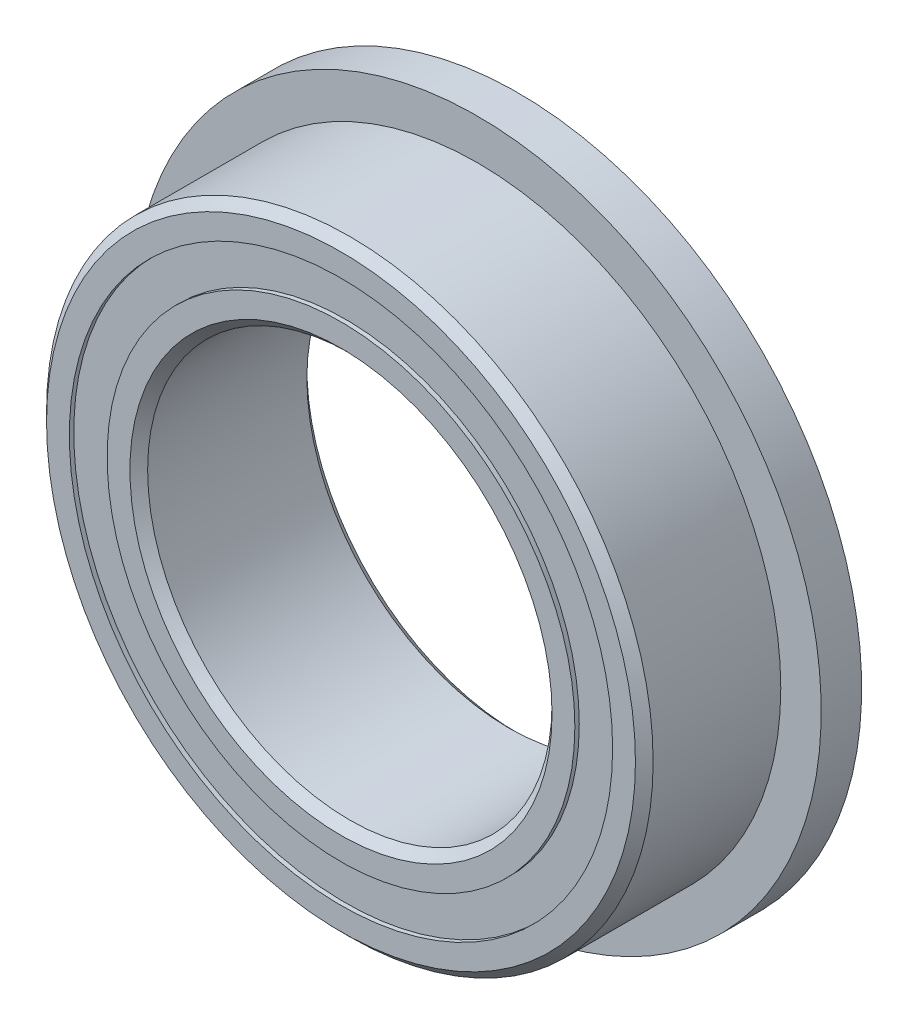
ISO-10303-21;
HEADER;
FILE_DESCRIPTION(('STEP AP214'),'2;1');
FILE_NAME('part.step','',(''),(''),'','','');
FILE_SCHEMA(('AUTOMOTIVE_DESIGN { 1 0 10303 214 1 1 1 1 }'));
ENDSEC;
DATA;
#1=APPLICATION_CONTEXT('core data for automotive mechanical design processes');
#2=APPLICATION_PROTOCOL_DEFINITION('international standard','automotive_design',2000,#1);
#3=PRODUCT_CONTEXT('',#1,'mechanical');
#4=PRODUCT('Part','Part','',(#3));
#5=PRODUCT_RELATED_PRODUCT_CATEGORY('part','',(#4));
#6=PRODUCT_DEFINITION_FORMATION('','',#4);
#7=PRODUCT_DEFINITION_CONTEXT('part definition',#1,'design');
#8=PRODUCT_DEFINITION('design','',#6,#7);
#9=PRODUCT_DEFINITION_SHAPE('','',#8);
#10=(LENGTH_UNIT() NAMED_UNIT(*) SI_UNIT(.MILLI.,.METRE.));
#11=(NAMED_UNIT(*) PLANE_ANGLE_UNIT() SI_UNIT($,.RADIAN.));
#12=(NAMED_UNIT(*) SI_UNIT($,.STERADIAN.) SOLID_ANGLE_UNIT());
#13=UNCERTAINTY_MEASURE_WITH_UNIT(LENGTH_MEASURE(1.E-05),#10,'distance_accuracy_value','');
#14=(GEOMETRIC_REPRESENTATION_CONTEXT(3) GLOBAL_UNCERTAINTY_ASSIGNED_CONTEXT((#13)) GLOBAL_UNIT_ASSIGNED_CONTEXT((#10,
#11,#12)) REPRESENTATION_CONTEXT('',''));
#15=CARTESIAN_POINT('',(0.,0.,0.));
#16=DIRECTION('',(0.,0.,1.));
#17=DIRECTION('',(1.,0.,0.));
#18=AXIS2_PLACEMENT_3D('',#15,#16,#17);
#19=CARTESIAN_POINT('',(0.,5.37362637362637,-1.6625));
#20=DIRECTION('',(0.,0.,1.));
#21=DIRECTION('',(1.,0.,0.));
#22=AXIS2_PLACEMENT_3D('',#19,#20,#21);
#23=PLANE('',#22);
#24=CARTESIAN_POINT('',(0.,0.,-1.6625));
#25=DIRECTION('',(0.,0.,1.));
#26=DIRECTION('',(1.,0.,0.));
#27=AXIS2_PLACEMENT_3D('',#24,#25,#26);
#28=CIRCLE('',#27,5.37362637362637);
#29=CARTESIAN_POINT('',(5.37362637362637,0.,-1.6625));
#30=VERTEX_POINT('',#29);
#31=EDGE_CURVE('E56',#30,#30,#28,.T.);
#32=ORIENTED_EDGE('',*,*,#31,.F.);
#33=EDGE_LOOP('',(#32));
#34=FACE_BOUND('',#33,.T.);
#35=CARTESIAN_POINT('',(0.,0.,-1.6625));
#36=DIRECTION('',(0.,0.,1.));
#37=DIRECTION('',(1.,0.,0.));
#38=AXIS2_PLACEMENT_3D('',#35,#36,#37);
#39=CIRCLE('',#38,4.62637362637363);
#40=CARTESIAN_POINT('',(4.62637362637363,0.,-1.6625));
#41=VERTEX_POINT('',#40);
#42=EDGE_CURVE('E11',#41,#41,#39,.T.);
#43=ORIENTED_EDGE('',*,*,#42,.T.);
#44=EDGE_LOOP('',(#43));
#45=FACE_BOUND('',#44,.T.);
#46=ADVANCED_FACE('F42',(#34,#45),#23,.F.);
#47=CARTESIAN_POINT('',(0.,0.,1.75));
#48=DIRECTION('',(0.,0.,1.));
#49=DIRECTION('',(1.,0.,0.));
#50=AXIS2_PLACEMENT_3D('',#47,#48,#49);
#51=CYLINDRICAL_SURFACE('',#50,4.62637362637363);
#52=ORIENTED_EDGE('',*,*,#42,.F.);
#53=EDGE_LOOP('',(#52));
#54=FACE_BOUND('',#53,.T.);
#55=CARTESIAN_POINT('',(0.,0.,-0.862864380232568));
#56=DIRECTION('',(0.,0.,1.));
#57=DIRECTION('',(1.,0.,0.));
#58=AXIS2_PLACEMENT_3D('',#55,#56,#57);
#59=CIRCLE('',#58,4.62637362637363);
#60=CARTESIAN_POINT('',(4.62637362637363,0.,-0.862864380232568));
#61=VERTEX_POINT('',#60);
#62=EDGE_CURVE('E48',#61,#61,#59,.T.);
#63=ORIENTED_EDGE('',*,*,#62,.T.);
#64=EDGE_LOOP('',(#63));
#65=FACE_BOUND('',#64,.T.);
#66=ADVANCED_FACE('F65',(#54,#65),#51,.F.);
#67=CARTESIAN_POINT('',(0.,5.37362637362637,-0.862864380232568));
#68=DIRECTION('',(0.,0.,-1.));
#69=DIRECTION('',(-1.,0.,0.));
#70=AXIS2_PLACEMENT_3D('',#67,#68,#69);
#71=PLANE('',#70);
#72=ORIENTED_EDGE('',*,*,#62,.F.);
#73=EDGE_LOOP('',(#72));
#74=FACE_BOUND('',#73,.T.);
#75=CARTESIAN_POINT('',(0.,0.,-0.862864380232568));
#76=DIRECTION('',(0.,0.,1.));
#77=DIRECTION('',(1.,0.,0.));
#78=AXIS2_PLACEMENT_3D('',#75,#76,#77);
#79=CIRCLE('',#78,5.37362637362637);
#80=CARTESIAN_POINT('',(5.37362637362637,0.,-0.862864380232568));
#81=VERTEX_POINT('',#80);
#82=EDGE_CURVE('E52',#81,#81,#79,.T.);
#83=ORIENTED_EDGE('',*,*,#82,.T.);
#84=EDGE_LOOP('',(#83));
#85=FACE_BOUND('',#84,.T.);
#86=ADVANCED_FACE('F69',(#74,#85),#71,.F.);
#87=CARTESIAN_POINT('',(0.,0.,1.75));
#88=DIRECTION('',(0.,0.,1.));
#89=DIRECTION('',(1.,0.,0.));
#90=AXIS2_PLACEMENT_3D('',#87,#88,#89);
#91=CYLINDRICAL_SURFACE('',#90,5.37362637362637);
#92=ORIENTED_EDGE('',*,*,#82,.F.);
#93=EDGE_LOOP('',(#92));
#94=FACE_BOUND('',#93,.T.);
#95=ORIENTED_EDGE('',*,*,#31,.T.);
#96=EDGE_LOOP('',(#95));
#97=FACE_BOUND('',#96,.T.);
#98=ADVANCED_FACE('F62',(#94,#97),#91,.T.);
#99=CLOSED_SHELL('',(#46,#66,#86,#98));
#100=MANIFOLD_SOLID_BREP('B2',#99);
#101=CARTESIAN_POINT('',(0.,5.37362637362637,1.6625));
#102=DIRECTION('',(0.,0.,-1.));
#103=DIRECTION('',(-1.,0.,0.));
#104=AXIS2_PLACEMENT_3D('',#101,#102,#103);
#105=PLANE('',#104);
#106=CARTESIAN_POINT('',(0.,0.,1.6625));
#107=DIRECTION('',(0.,0.,1.));
#108=DIRECTION('',(1.,0.,0.));
#109=AXIS2_PLACEMENT_3D('',#106,#107,#108);
#110=CIRCLE('',#109,4.62637362637363);
#111=CARTESIAN_POINT('',(4.62637362637363,0.,1.6625));
#112=VERTEX_POINT('',#111);
#113=EDGE_CURVE('E41',#112,#112,#110,.T.);
#114=ORIENTED_EDGE('',*,*,#113,.F.);
#115=EDGE_LOOP('',(#114));
#116=FACE_BOUND('',#115,.T.);
#117=CARTESIAN_POINT('',(0.,0.,1.6625));
#118=DIRECTION('',(0.,0.,1.));
#119=DIRECTION('',(1.,0.,0.));
#120=AXIS2_PLACEMENT_3D('',#117,#118,#119);
#121=CIRCLE('',#120,5.37362637362637);
#122=CARTESIAN_POINT('',(5.37362637362637,0.,1.6625));
#123=VERTEX_POINT('',#122);
#124=EDGE_CURVE('E124',#123,#123,#121,.T.);
#125=ORIENTED_EDGE('',*,*,#124,.T.);
#126=EDGE_LOOP('',(#125));
#127=FACE_BOUND('',#126,.T.);
#128=ADVANCED_FACE('F110',(#116,#127),#105,.F.);
#129=CARTESIAN_POINT('',(0.,0.,1.75));
#130=DIRECTION('',(0.,0.,1.));
#131=DIRECTION('',(1.,0.,0.));
#132=AXIS2_PLACEMENT_3D('',#129,#130,#131);
#133=CYLINDRICAL_SURFACE('',#132,4.62637362637363);
#134=CARTESIAN_POINT('',(0.,0.,0.862864380232567));
#135=DIRECTION('',(0.,0.,1.));
#136=DIRECTION('',(1.,0.,0.));
#137=AXIS2_PLACEMENT_3D('',#134,#135,#136);
#138=CIRCLE('',#137,4.62637362637363);
#139=CARTESIAN_POINT('',(4.62637362637363,0.,0.862864380232567));
#140=VERTEX_POINT('',#139);
#141=EDGE_CURVE('E116',#140,#140,#138,.T.);
#142=ORIENTED_EDGE('',*,*,#141,.F.);
#143=EDGE_LOOP('',(#142));
#144=FACE_BOUND('',#143,.T.);
#145=ORIENTED_EDGE('',*,*,#113,.T.);
#146=EDGE_LOOP('',(#145));
#147=FACE_BOUND('',#146,.T.);
#148=ADVANCED_FACE('F139',(#144,#147),#133,.F.);
#149=CARTESIAN_POINT('',(0.,5.37362637362637,0.862864380232567));
#150=DIRECTION('',(0.,0.,1.));
#151=DIRECTION('',(1.,0.,0.));
#152=AXIS2_PLACEMENT_3D('',#149,#150,#151);
#153=PLANE('',#152);
#154=CARTESIAN_POINT('',(0.,0.,0.862864380232567));
#155=DIRECTION('',(0.,0.,1.));
#156=DIRECTION('',(1.,0.,0.));
#157=AXIS2_PLACEMENT_3D('',#154,#155,#156);
#158=CIRCLE('',#157,5.37362637362637);
#159=CARTESIAN_POINT('',(5.37362637362637,0.,0.862864380232567));
#160=VERTEX_POINT('',#159);
#161=EDGE_CURVE('E120',#160,#160,#158,.T.);
#162=ORIENTED_EDGE('',*,*,#161,.F.);
#163=EDGE_LOOP('',(#162));
#164=FACE_BOUND('',#163,.T.);
#165=ORIENTED_EDGE('',*,*,#141,.T.);
#166=EDGE_LOOP('',(#165));
#167=FACE_BOUND('',#166,.T.);
#168=ADVANCED_FACE('F134',(#164,#167),#153,.F.);
#169=CARTESIAN_POINT('',(0.,0.,1.75));
#170=DIRECTION('',(0.,0.,1.));
#171=DIRECTION('',(1.,0.,0.));
#172=AXIS2_PLACEMENT_3D('',#169,#170,#171);
#173=CYLINDRICAL_SURFACE('',#172,5.37362637362637);
#174=ORIENTED_EDGE('',*,*,#124,.F.);
#175=EDGE_LOOP('',(#174));
#176=FACE_BOUND('',#175,.T.);
#177=ORIENTED_EDGE('',*,*,#161,.T.);
#178=EDGE_LOOP('',(#177));
#179=FACE_BOUND('',#178,.T.);
#180=ADVANCED_FACE('F131',(#176,#179),#173,.T.);
#181=CLOSED_SHELL('',(#128,#148,#168,#180));
#182=MANIFOLD_SOLID_BREP('B6',#181);
#183=CARTESIAN_POINT('',(-2.49999999999994,4.33012701892223,0.));
#184=DIRECTION('',(0.,0.,1.));
#185=DIRECTION('',(0.499999999999989,-0.866025403784445,0.));
#186=AXIS2_PLACEMENT_3D('',#183,#184,#185);
#187=SPHERICAL_SURFACE('',#186,0.862864380232568);
#188=CARTESIAN_POINT('',(-2.49999999999994,4.33012701892223,0.862864380232567));
#189=VERTEX_POINT('',#188);
#190=VERTEX_LOOP('',#189);
#191=FACE_BOUND('',#190,.T.);
#192=ADVANCED_FACE('F179',(#191),#187,.T.);
#193=CLOSED_SHELL('',(#192));
#194=MANIFOLD_SOLID_BREP('B36_NOT_SHOWN',#193);
#195=CARTESIAN_POINT('',(-4.33012701892216,2.50000000000005,0.));
#196=DIRECTION('',(0.,0.,1.));
#197=DIRECTION('',(0.866025403784433,-0.50000000000001,0.));
#198=AXIS2_PLACEMENT_3D('',#195,#196,#197);
#199=SPHERICAL_SURFACE('',#198,0.862864380232568);
#200=CARTESIAN_POINT('',(-4.33012701892216,2.50000000000005,0.862864380232567));
#201=VERTEX_POINT('',#200);
#202=VERTEX_LOOP('',#201);
#203=FACE_BOUND('',#202,.T.);
#204=ADVANCED_FACE('F200',(#203),#199,.T.);
#205=CLOSED_SHELL('',(#204));
#206=MANIFOLD_SOLID_BREP('B106_NOT_SHOWN',#205);
#207=CARTESIAN_POINT('',(-5.,0.,0.));
#208=DIRECTION('',(0.,0.,1.));
#209=DIRECTION('',(1.,0.,0.));
#210=AXIS2_PLACEMENT_3D('',#207,#208,#209);
#211=SPHERICAL_SURFACE('',#210,0.862864380232568);
#212=CARTESIAN_POINT('',(-5.,0.,0.862864380232567));
#213=VERTEX_POINT('',#212);
#214=VERTEX_LOOP('',#213);
#215=FACE_BOUND('',#214,.T.);
#216=ADVANCED_FACE('F221',(#215),#211,.T.);
#217=CLOSED_SHELL('',(#216));
#218=MANIFOLD_SOLID_BREP('B175_NOT_SHOWN',#217);
#219=CARTESIAN_POINT('',(-4.33012701892222,-2.49999999999996,0.));
#220=DIRECTION('',(0.,0.,1.));
#221=DIRECTION('',(0.866025403784443,0.499999999999992,0.));
#222=AXIS2_PLACEMENT_3D('',#219,#220,#221);
#223=SPHERICAL_SURFACE('',#222,0.862864380232568);
#224=CARTESIAN_POINT('',(-4.33012701892222,-2.49999999999996,0.862864380232567));
#225=VERTEX_POINT('',#224);
#226=VERTEX_LOOP('',#225);
#227=FACE_BOUND('',#226,.T.);
#228=ADVANCED_FACE('F242',(#227),#223,.T.);
#229=CLOSED_SHELL('',(#228));
#230=MANIFOLD_SOLID_BREP('B196_NOT_SHOWN',#229);
#231=CARTESIAN_POINT('',(-2.50000000000004,-4.33012701892217,0.));
#232=DIRECTION('',(0.,0.,1.));
#233=DIRECTION('',(0.500000000000007,0.866025403784435,0.));
#234=AXIS2_PLACEMENT_3D('',#231,#232,#233);
#235=SPHERICAL_SURFACE('',#234,0.862864380232568);
#236=CARTESIAN_POINT('',(-2.50000000000004,-4.33012701892217,0.862864380232567));
#237=VERTEX_POINT('',#236);
#238=VERTEX_LOOP('',#237);
#239=FACE_BOUND('',#238,.T.);
#240=ADVANCED_FACE('F263',(#239),#235,.T.);
#241=CLOSED_SHELL('',(#240));
#242=MANIFOLD_SOLID_BREP('B217_NOT_SHOWN',#241);
#243=CARTESIAN_POINT('',(0.,-5.,0.));
#244=DIRECTION('',(0.,0.,1.));
#245=DIRECTION('',(0.,1.,0.));
#246=AXIS2_PLACEMENT_3D('',#243,#244,#245);
#247=SPHERICAL_SURFACE('',#246,0.862864380232568);
#248=CARTESIAN_POINT('',(0.,-5.,0.862864380232567));
#249=VERTEX_POINT('',#248);
#250=VERTEX_LOOP('',#249);
#251=FACE_BOUND('',#250,.T.);
#252=ADVANCED_FACE('F284',(#251),#247,.T.);
#253=CLOSED_SHELL('',(#252));
#254=MANIFOLD_SOLID_BREP('B238_NOT_SHOWN',#253);
#255=CARTESIAN_POINT('',(2.49999999999997,-4.33012701892221,0.));
#256=DIRECTION('',(0.,0.,1.));
#257=DIRECTION('',(-0.499999999999995,0.866025403784442,0.));
#258=AXIS2_PLACEMENT_3D('',#255,#256,#257);
#259=SPHERICAL_SURFACE('',#258,0.862864380232568);
#260=CARTESIAN_POINT('',(2.49999999999997,-4.33012701892221,0.862864380232567));
#261=VERTEX_POINT('',#260);
#262=VERTEX_LOOP('',#261);
#263=FACE_BOUND('',#262,.T.);
#264=ADVANCED_FACE('F305',(#263),#259,.T.);
#265=CLOSED_SHELL('',(#264));
#266=MANIFOLD_SOLID_BREP('B259_NOT_SHOWN',#265);
#267=CARTESIAN_POINT('',(4.33012701892218,-2.50000000000002,0.));
#268=DIRECTION('',(0.,0.,1.));
#269=DIRECTION('',(-0.866025403784436,0.500000000000004,0.));
#270=AXIS2_PLACEMENT_3D('',#267,#268,#269);
#271=SPHERICAL_SURFACE('',#270,0.862864380232568);
#272=CARTESIAN_POINT('',(4.33012701892218,-2.50000000000002,0.862864380232567));
#273=VERTEX_POINT('',#272);
#274=VERTEX_LOOP('',#273);
#275=FACE_BOUND('',#274,.T.);
#276=ADVANCED_FACE('F326',(#275),#271,.T.);
#277=CLOSED_SHELL('',(#276));
#278=MANIFOLD_SOLID_BREP('B280_NOT_SHOWN',#277);
#279=CARTESIAN_POINT('',(5.,0.,0.));
#280=DIRECTION('',(0.,0.,1.));
#281=DIRECTION('',(-1.,0.,0.));
#282=AXIS2_PLACEMENT_3D('',#279,#280,#281);
#283=SPHERICAL_SURFACE('',#282,0.862864380232568);
#284=CARTESIAN_POINT('',(5.,0.,0.862864380232567));
#285=VERTEX_POINT('',#284);
#286=VERTEX_LOOP('',#285);
#287=FACE_BOUND('',#286,.T.);
#288=ADVANCED_FACE('F347',(#287),#283,.T.);
#289=CLOSED_SHELL('',(#288));
#290=MANIFOLD_SOLID_BREP('B301_NOT_SHOWN',#289);
#291=CARTESIAN_POINT('',(4.3301270189222,2.49999999999999,0.));
#292=DIRECTION('',(0.,0.,1.));
#293=DIRECTION('',(-0.86602540378444,-0.499999999999998,0.));
#294=AXIS2_PLACEMENT_3D('',#291,#292,#293);
#295=SPHERICAL_SURFACE('',#294,0.862864380232568);
#296=CARTESIAN_POINT('',(4.3301270189222,2.49999999999999,0.862864380232567));
#297=VERTEX_POINT('',#296);
#298=VERTEX_LOOP('',#297);
#299=FACE_BOUND('',#298,.T.);
#300=ADVANCED_FACE('F368',(#299),#295,.T.);
#301=CLOSED_SHELL('',(#300));
#302=MANIFOLD_SOLID_BREP('B322_NOT_SHOWN',#301);
#303=CARTESIAN_POINT('',(2.50000000000001,4.33012701892219,0.));
#304=DIRECTION('',(0.,0.,1.));
#305=DIRECTION('',(-0.500000000000001,-0.866025403784438,0.));
#306=AXIS2_PLACEMENT_3D('',#303,#304,#305);
#307=SPHERICAL_SURFACE('',#306,0.862864380232568);
#308=CARTESIAN_POINT('',(2.50000000000001,4.33012701892219,0.862864380232567));
#309=VERTEX_POINT('',#308);
#310=VERTEX_LOOP('',#309);
#311=FACE_BOUND('',#310,.T.);
#312=ADVANCED_FACE('F389',(#311),#307,.T.);
#313=CLOSED_SHELL('',(#312));
#314=MANIFOLD_SOLID_BREP('B343_NOT_SHOWN',#313);
#315=CARTESIAN_POINT('',(0.,5.,0.));
#316=DIRECTION('',(0.,0.,1.));
#317=DIRECTION('',(0.,-1.,0.));
#318=AXIS2_PLACEMENT_3D('',#315,#316,#317);
#319=SPHERICAL_SURFACE('',#318,0.862864380232568);
#320=CARTESIAN_POINT('',(0.,5.,0.862864380232567));
#321=VERTEX_POINT('',#320);
#322=VERTEX_LOOP('',#321);
#323=FACE_BOUND('',#322,.T.);
#324=ADVANCED_FACE('F411',(#323),#319,.T.);
#325=CLOSED_SHELL('',(#324));
#326=MANIFOLD_SOLID_BREP('B364',#325);
#327=CARTESIAN_POINT('',(0.,4.62637362637363,1.75));
#328=DIRECTION('',(0.,0.,-1.));
#329=DIRECTION('',(-1.,0.,0.));
#330=AXIS2_PLACEMENT_3D('',#327,#328,#329);
#331=PLANE('',#330);
#332=CARTESIAN_POINT('',(0.,0.,1.75));
#333=DIRECTION('',(0.,0.,1.));
#334=DIRECTION('',(1.,0.,0.));
#335=AXIS2_PLACEMENT_3D('',#332,#333,#334);
#336=CIRCLE('',#335,4.175);
#337=CARTESIAN_POINT('',(4.175,0.,1.75));
#338=VERTEX_POINT('',#337);
#339=EDGE_CURVE('E459',#338,#338,#336,.T.);
#340=ORIENTED_EDGE('',*,*,#339,.F.);
#341=EDGE_LOOP('',(#340));
#342=FACE_BOUND('',#341,.T.);
#343=CARTESIAN_POINT('',(0.,0.,1.75));
#344=DIRECTION('',(0.,0.,1.));
#345=DIRECTION('',(1.,0.,0.));
#346=AXIS2_PLACEMENT_3D('',#343,#344,#345);
#347=CIRCLE('',#346,4.62637362637363);
#348=CARTESIAN_POINT('',(4.62637362637363,0.,1.75));
#349=VERTEX_POINT('',#348);
#350=EDGE_CURVE('E410',#349,#349,#347,.T.);
#351=ORIENTED_EDGE('',*,*,#350,.T.);
#352=EDGE_LOOP('',(#351));
#353=FACE_BOUND('',#352,.T.);
#354=ADVANCED_FACE('F431',(#342,#353),#331,.F.);
#355=CARTESIAN_POINT('',(0.,0.,1.75));
#356=DIRECTION('',(0.,0.,1.));
#357=DIRECTION('',(1.,0.,0.));
#358=AXIS2_PLACEMENT_3D('',#355,#356,#357);
#359=CYLINDRICAL_SURFACE('',#358,4.62637362637363);
#360=ORIENTED_EDGE('',*,*,#350,.F.);
#361=EDGE_LOOP('',(#360));
#362=FACE_BOUND('',#361,.T.);
#363=CARTESIAN_POINT('',(0.,0.,0.777777777777777));
#364=DIRECTION('',(0.,0.,1.));
#365=DIRECTION('',(1.,0.,0.));
#366=AXIS2_PLACEMENT_3D('',#363,#364,#365);
#367=CIRCLE('',#366,4.62637362637363);
#368=CARTESIAN_POINT('',(4.62637362637363,0.,0.777777777777777));
#369=VERTEX_POINT('',#368);
#370=EDGE_CURVE('E437',#369,#369,#367,.T.);
#371=ORIENTED_EDGE('',*,*,#370,.T.);
#372=EDGE_LOOP('',(#371));
#373=FACE_BOUND('',#372,.T.);
#374=ADVANCED_FACE('F466',(#362,#373),#359,.T.);
#375=CARTESIAN_POINT('',(0.,0.,0.));
#376=DIRECTION('',(0.,0.,1.));
#377=DIRECTION('',(1.,0.,0.));
#378=AXIS2_PLACEMENT_3D('',#375,#376,#377);
#379=TOROIDAL_SURFACE('',#378,5.,0.862864380232566);
#380=ORIENTED_EDGE('',*,*,#370,.F.);
#381=EDGE_LOOP('',(#380));
#382=FACE_BOUND('',#381,.T.);
#383=CARTESIAN_POINT('',(0.,0.,-0.777777777777779));
#384=DIRECTION('',(0.,0.,1.));
#385=DIRECTION('',(1.,0.,0.));
#386=AXIS2_PLACEMENT_3D('',#383,#384,#385);
#387=CIRCLE('',#386,4.62637362637362);
#388=CARTESIAN_POINT('',(4.62637362637362,0.,-0.777777777777779));
#389=VERTEX_POINT('',#388);
#390=EDGE_CURVE('E441',#389,#389,#387,.T.);
#391=ORIENTED_EDGE('',*,*,#390,.T.);
#392=EDGE_LOOP('',(#391));
#393=FACE_BOUND('',#392,.T.);
#394=ADVANCED_FACE('F470',(#382,#393),#379,.F.);
#395=CARTESIAN_POINT('',(0.,0.,1.75));
#396=DIRECTION('',(0.,0.,1.));
#397=DIRECTION('',(1.,0.,0.));
#398=AXIS2_PLACEMENT_3D('',#395,#396,#397);
#399=CYLINDRICAL_SURFACE('',#398,4.62637362637362);
#400=ORIENTED_EDGE('',*,*,#390,.F.);
#401=EDGE_LOOP('',(#400));
#402=FACE_BOUND('',#401,.T.);
#403=CARTESIAN_POINT('',(0.,0.,-1.75));
#404=DIRECTION('',(0.,0.,1.));
#405=DIRECTION('',(1.,0.,0.));
#406=AXIS2_PLACEMENT_3D('',#403,#404,#405);
#407=CIRCLE('',#406,4.62637362637363);
#408=CARTESIAN_POINT('',(4.62637362637363,0.,-1.75));
#409=VERTEX_POINT('',#408);
#410=EDGE_CURVE('E445',#409,#409,#407,.T.);
#411=ORIENTED_EDGE('',*,*,#410,.T.);
#412=EDGE_LOOP('',(#411));
#413=FACE_BOUND('',#412,.T.);
#414=ADVANCED_FACE('F475',(#402,#413),#399,.T.);
#415=CARTESIAN_POINT('',(0.,4.175,-1.75));
#416=DIRECTION('',(0.,0.,1.));
#417=DIRECTION('',(1.,0.,0.));
#418=AXIS2_PLACEMENT_3D('',#415,#416,#417);
#419=PLANE('',#418);
#420=ORIENTED_EDGE('',*,*,#410,.F.);
#421=EDGE_LOOP('',(#420));
#422=FACE_BOUND('',#421,.T.);
#423=CARTESIAN_POINT('',(0.,0.,-1.75));
#424=DIRECTION('',(0.,0.,1.));
#425=DIRECTION('',(1.,0.,0.));
#426=AXIS2_PLACEMENT_3D('',#423,#424,#425);
#427=CIRCLE('',#426,4.175);
#428=CARTESIAN_POINT('',(4.175,0.,-1.75));
#429=VERTEX_POINT('',#428);
#430=EDGE_CURVE('E450',#429,#429,#427,.T.);
#431=ORIENTED_EDGE('',*,*,#430,.T.);
#432=EDGE_LOOP('',(#431));
#433=FACE_BOUND('',#432,.T.);
#434=ADVANCED_FACE('F481',(#422,#433),#419,.F.);
#435=CARTESIAN_POINT('',(0.,0.,-1.575));
#436=DIRECTION('',(0.,0.,-1.));
#437=DIRECTION('',(-1.,0.,0.));
#438=AXIS2_PLACEMENT_3D('',#435,#436,#437);
#439=CONICAL_SURFACE('',#438,4.,0.785398163397448);
#440=ORIENTED_EDGE('',*,*,#430,.F.);
#441=EDGE_LOOP('',(#440));
#442=FACE_BOUND('',#441,.T.);
#443=CARTESIAN_POINT('',(0.,0.,-1.575));
#444=DIRECTION('',(0.,0.,1.));
#445=DIRECTION('',(1.,0.,0.));
#446=AXIS2_PLACEMENT_3D('',#443,#444,#445);
#447=CIRCLE('',#446,4.);
#448=CARTESIAN_POINT('',(4.,0.,-1.575));
#449=VERTEX_POINT('',#448);
#450=EDGE_CURVE('E453',#449,#449,#447,.T.);
#451=ORIENTED_EDGE('',*,*,#450,.T.);
#452=EDGE_LOOP('',(#451));
#453=FACE_BOUND('',#452,.T.);
#454=ADVANCED_FACE('F485',(#442,#453),#439,.F.);
#455=CARTESIAN_POINT('',(0.,0.,1.75));
#456=DIRECTION('',(0.,0.,1.));
#457=DIRECTION('',(1.,0.,0.));
#458=AXIS2_PLACEMENT_3D('',#455,#456,#457);
#459=CYLINDRICAL_SURFACE('',#458,4.);
#460=ORIENTED_EDGE('',*,*,#450,.F.);
#461=EDGE_LOOP('',(#460));
#462=FACE_BOUND('',#461,.T.);
#463=CARTESIAN_POINT('',(0.,0.,1.575));
#464=DIRECTION('',(0.,0.,1.));
#465=DIRECTION('',(1.,0.,0.));
#466=AXIS2_PLACEMENT_3D('',#463,#464,#465);
#467=CIRCLE('',#466,4.);
#468=CARTESIAN_POINT('',(4.,0.,1.575));
#469=VERTEX_POINT('',#468);
#470=EDGE_CURVE('E456',#469,#469,#467,.T.);
#471=ORIENTED_EDGE('',*,*,#470,.T.);
#472=EDGE_LOOP('',(#471));
#473=FACE_BOUND('',#472,.T.);
#474=ADVANCED_FACE('F489',(#462,#473),#459,.F.);
#475=CARTESIAN_POINT('',(0.,0.,1.75));
#476=DIRECTION('',(0.,0.,1.));
#477=DIRECTION('',(1.,0.,0.));
#478=AXIS2_PLACEMENT_3D('',#475,#476,#477);
#479=CONICAL_SURFACE('',#478,4.175,0.785398163397447);
#480=ORIENTED_EDGE('',*,*,#470,.F.);
#481=EDGE_LOOP('',(#480));
#482=FACE_BOUND('',#481,.T.);
#483=ORIENTED_EDGE('',*,*,#339,.T.);
#484=EDGE_LOOP('',(#483));
#485=FACE_BOUND('',#484,.T.);
#486=ADVANCED_FACE('F463',(#482,#485),#479,.F.);
#487=CLOSED_SHELL('',(#354,#374,#394,#414,#434,#454,#474,#486));
#488=MANIFOLD_SOLID_BREP('B385',#487);
#489=CARTESIAN_POINT('',(0.,0.,1.575));
#490=DIRECTION('',(0.,0.,-1.));
#491=DIRECTION('',(-1.,0.,0.));
#492=AXIS2_PLACEMENT_3D('',#489,#490,#491);
#493=CONICAL_SURFACE('',#492,6.,0.78539816339745);
#494=CARTESIAN_POINT('',(0.,0.,1.75));
#495=DIRECTION('',(0.,0.,1.));
#496=DIRECTION('',(1.,0.,0.));
#497=AXIS2_PLACEMENT_3D('',#494,#495,#496);
#498=CIRCLE('',#497,5.825);
#499=CARTESIAN_POINT('',(5.825,0.,1.75));
#500=VERTEX_POINT('',#499);
#501=EDGE_CURVE('E575',#500,#500,#498,.T.);
#502=ORIENTED_EDGE('',*,*,#501,.F.);
#503=EDGE_LOOP('',(#502));
#504=FACE_BOUND('',#503,.T.);
#505=CARTESIAN_POINT('',(0.,0.,1.575));
#506=DIRECTION('',(0.,0.,1.));
#507=DIRECTION('',(1.,0.,0.));
#508=AXIS2_PLACEMENT_3D('',#505,#506,#507);
#509=CIRCLE('',#508,6.);
#510=CARTESIAN_POINT('',(6.,0.,1.575));
#511=VERTEX_POINT('',#510);
#512=EDGE_CURVE('E430',#511,#511,#509,.T.);
#513=ORIENTED_EDGE('',*,*,#512,.T.);
#514=EDGE_LOOP('',(#513));
#515=FACE_BOUND('',#514,.T.);
#516=ADVANCED_FACE('F553',(#504,#515),#493,.T.);
#517=CARTESIAN_POINT('',(0.,0.,1.75));
#518=DIRECTION('',(0.,0.,1.));
#519=DIRECTION('',(1.,0.,0.));
#520=AXIS2_PLACEMENT_3D('',#517,#518,#519);
#521=CYLINDRICAL_SURFACE('',#520,6.);
#522=CARTESIAN_POINT('',(0.,0.,-0.95));
#523=DIRECTION('',(0.,0.,1.));
#524=DIRECTION('',(1.,0.,0.));
#525=AXIS2_PLACEMENT_3D('',#522,#523,#524);
#526=CIRCLE('',#525,6.);
#527=CARTESIAN_POINT('',(6.,0.,-0.95));
#528=VERTEX_POINT('',#527);
#529=EDGE_CURVE('E578',#528,#528,#526,.T.);
#530=ORIENTED_EDGE('',*,*,#529,.T.);
#531=EDGE_LOOP('',(#530));
#532=FACE_BOUND('',#531,.T.);
#533=ORIENTED_EDGE('',*,*,#512,.F.);
#534=EDGE_LOOP('',(#533));
#535=FACE_BOUND('',#534,.T.);
#536=ADVANCED_FACE('F598',(#532,#535),#521,.T.);
#537=CARTESIAN_POINT('',(0.,5.825,-1.75));
#538=DIRECTION('',(0.,0.,1.));
#539=DIRECTION('',(1.,0.,0.));
#540=AXIS2_PLACEMENT_3D('',#537,#538,#539);
#541=PLANE('',#540);
#542=CARTESIAN_POINT('',(0.,0.,-1.75));
#543=DIRECTION('',(0.,0.,1.));
#544=DIRECTION('',(1.,0.,0.));
#545=AXIS2_PLACEMENT_3D('',#542,#543,#544);
#546=CIRCLE('',#545,5.37362637362637);
#547=CARTESIAN_POINT('',(5.37362637362637,0.,-1.75));
#548=VERTEX_POINT('',#547);
#549=EDGE_CURVE('E559',#548,#548,#546,.T.);
#550=ORIENTED_EDGE('',*,*,#549,.T.);
#551=EDGE_LOOP('',(#550));
#552=FACE_BOUND('',#551,.T.);
#553=CARTESIAN_POINT('',(0.,0.,-1.75));
#554=DIRECTION('',(0.,0.,-1.));
#555=DIRECTION('',(-1.,0.,0.));
#556=AXIS2_PLACEMENT_3D('',#553,#554,#555);
#557=CIRCLE('',#556,6.8);
#558=CARTESIAN_POINT('',(-6.8,0.,-1.75));
#559=VERTEX_POINT('',#558);
#560=EDGE_CURVE('E581',#559,#559,#557,.T.);
#561=ORIENTED_EDGE('',*,*,#560,.T.);
#562=EDGE_LOOP('',(#561));
#563=FACE_BOUND('',#562,.T.);
#564=ADVANCED_FACE('F601',(#552,#563),#541,.F.);
#565=CARTESIAN_POINT('',(0.,0.,1.75));
#566=DIRECTION('',(0.,0.,1.));
#567=DIRECTION('',(1.,0.,0.));
#568=AXIS2_PLACEMENT_3D('',#565,#566,#567);
#569=CYLINDRICAL_SURFACE('',#568,5.37362637362637);
#570=CARTESIAN_POINT('',(0.,0.,-0.777777777777778));
#571=DIRECTION('',(0.,0.,1.));
#572=DIRECTION('',(1.,0.,0.));
#573=AXIS2_PLACEMENT_3D('',#570,#571,#572);
#574=CIRCLE('',#573,5.37362637362637);
#575=CARTESIAN_POINT('',(5.37362637362637,0.,-0.777777777777778));
#576=VERTEX_POINT('',#575);
#577=EDGE_CURVE('E563',#576,#576,#574,.T.);
#578=ORIENTED_EDGE('',*,*,#577,.T.);
#579=EDGE_LOOP('',(#578));
#580=FACE_BOUND('',#579,.T.);
#581=ORIENTED_EDGE('',*,*,#549,.F.);
#582=EDGE_LOOP('',(#581));
#583=FACE_BOUND('',#582,.T.);
#584=ADVANCED_FACE('F606',(#580,#583),#569,.F.);
#585=CARTESIAN_POINT('',(0.,0.,0.));
#586=DIRECTION('',(0.,0.,1.));
#587=DIRECTION('',(1.,0.,0.));
#588=AXIS2_PLACEMENT_3D('',#585,#586,#587);
#589=TOROIDAL_SURFACE('',#588,5.,0.862864380232568);
#590=ORIENTED_EDGE('',*,*,#577,.F.);
#591=EDGE_LOOP('',(#590));
#592=FACE_BOUND('',#591,.T.);
#593=CARTESIAN_POINT('',(0.,0.,0.777777777777777));
#594=DIRECTION('',(0.,0.,1.));
#595=DIRECTION('',(1.,0.,0.));
#596=AXIS2_PLACEMENT_3D('',#593,#594,#595);
#597=CIRCLE('',#596,5.37362637362637);
#598=CARTESIAN_POINT('',(5.37362637362637,0.,0.777777777777777));
#599=VERTEX_POINT('',#598);
#600=EDGE_CURVE('E567',#599,#599,#597,.T.);
#601=ORIENTED_EDGE('',*,*,#600,.T.);
#602=EDGE_LOOP('',(#601));
#603=FACE_BOUND('',#602,.T.);
#604=ADVANCED_FACE('F612',(#592,#603),#589,.F.);
#605=CARTESIAN_POINT('',(0.,0.,1.75));
#606=DIRECTION('',(0.,0.,1.));
#607=DIRECTION('',(1.,0.,0.));
#608=AXIS2_PLACEMENT_3D('',#605,#606,#607);
#609=CYLINDRICAL_SURFACE('',#608,5.37362637362637);
#610=ORIENTED_EDGE('',*,*,#600,.F.);
#611=EDGE_LOOP('',(#610));
#612=FACE_BOUND('',#611,.T.);
#613=CARTESIAN_POINT('',(0.,0.,1.75));
#614=DIRECTION('',(0.,0.,1.));
#615=DIRECTION('',(1.,0.,0.));
#616=AXIS2_PLACEMENT_3D('',#613,#614,#615);
#617=CIRCLE('',#616,5.37362637362637);
#618=CARTESIAN_POINT('',(5.37362637362637,0.,1.75));
#619=VERTEX_POINT('',#618);
#620=EDGE_CURVE('E572',#619,#619,#617,.T.);
#621=ORIENTED_EDGE('',*,*,#620,.T.);
#622=EDGE_LOOP('',(#621));
#623=FACE_BOUND('',#622,.T.);
#624=ADVANCED_FACE('F616',(#612,#623),#609,.F.);
#625=CARTESIAN_POINT('',(0.,5.825,1.75));
#626=DIRECTION('',(0.,0.,-1.));
#627=DIRECTION('',(-1.,0.,0.));
#628=AXIS2_PLACEMENT_3D('',#625,#626,#627);
#629=PLANE('',#628);
#630=ORIENTED_EDGE('',*,*,#620,.F.);
#631=EDGE_LOOP('',(#630));
#632=FACE_BOUND('',#631,.T.);
#633=ORIENTED_EDGE('',*,*,#501,.T.);
#634=EDGE_LOOP('',(#633));
#635=FACE_BOUND('',#634,.T.);
#636=ADVANCED_FACE('F594',(#632,#635),#629,.F.);
#637=CARTESIAN_POINT('',(0.,5.37362637362637,-0.95));
#638=DIRECTION('',(0.,0.,1.));
#639=DIRECTION('',(1.,0.,0.));
#640=AXIS2_PLACEMENT_3D('',#637,#638,#639);
#641=PLANE('',#640);
#642=CARTESIAN_POINT('',(0.,0.,-0.95));
#643=DIRECTION('',(0.,0.,-1.));
#644=DIRECTION('',(-1.,0.,0.));
#645=AXIS2_PLACEMENT_3D('',#642,#643,#644);
#646=CIRCLE('',#645,6.8);
#647=CARTESIAN_POINT('',(-6.8,0.,-0.95));
#648=VERTEX_POINT('',#647);
#649=EDGE_CURVE('E584',#648,#648,#646,.T.);
#650=ORIENTED_EDGE('',*,*,#649,.F.);
#651=EDGE_LOOP('',(#650));
#652=FACE_BOUND('',#651,.T.);
#653=ORIENTED_EDGE('',*,*,#529,.F.);
#654=EDGE_LOOP('',(#653));
#655=FACE_BOUND('',#654,.T.);
#656=ADVANCED_FACE('F591',(#652,#655),#641,.T.);
#657=CARTESIAN_POINT('',(0.,0.,-1.75));
#658=DIRECTION('',(0.,0.,-1.));
#659=DIRECTION('',(-1.,0.,0.));
#660=AXIS2_PLACEMENT_3D('',#657,#658,#659);
#661=CYLINDRICAL_SURFACE('',#660,6.8);
#662=ORIENTED_EDGE('',*,*,#649,.T.);
#663=EDGE_LOOP('',(#662));
#664=FACE_BOUND('',#663,.T.);
#665=ORIENTED_EDGE('',*,*,#560,.F.);
#666=EDGE_LOOP('',(#665));
#667=FACE_BOUND('',#666,.T.);
#668=ADVANCED_FACE('F588',(#664,#667),#661,.T.);
#669=CLOSED_SHELL('',(#516,#536,#564,#584,#604,#624,#636,#656,#668));
#670=MANIFOLD_SOLID_BREP('B405',#669);
#671=ADVANCED_BREP_SHAPE_REPRESENTATION('',(#18,#100,#182,#194,#206,#218,#230,#242,#254,#266,
#278,#290,#302,#314,#326,#488,#670),#14);
#672=SHAPE_DEFINITION_REPRESENTATION(#9,#671);
ENDSEC;
END-ISO-10303-21;
